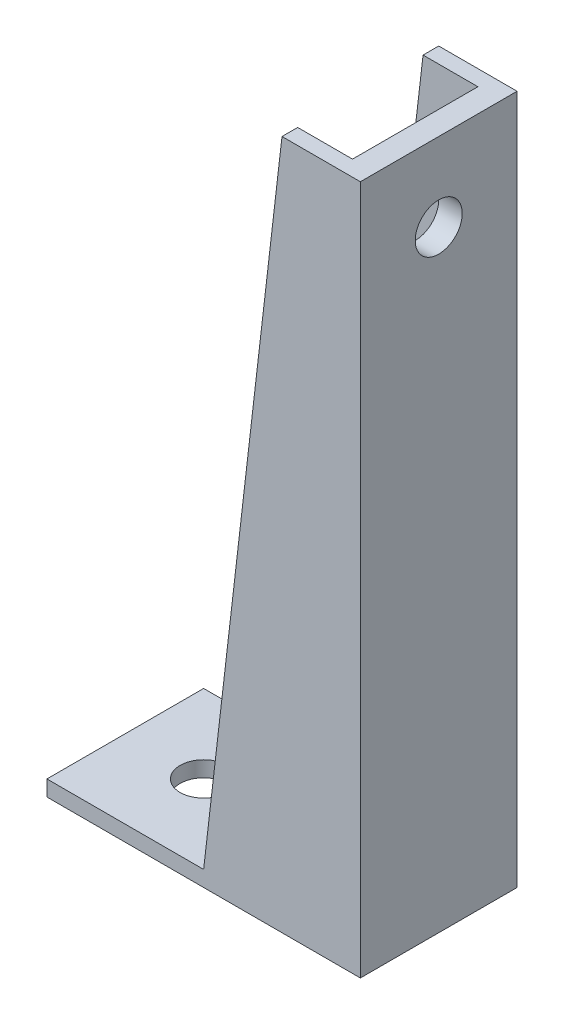
ISO-10303-21;
HEADER;
FILE_DESCRIPTION(('STEP AP214'),'2;1');
FILE_NAME('part.step','',(''),(''),'','','');
FILE_SCHEMA(('AUTOMOTIVE_DESIGN { 1 0 10303 214 1 1 1 1 }'));
ENDSEC;
DATA;
#1=APPLICATION_CONTEXT('core data for automotive mechanical design processes');
#2=APPLICATION_PROTOCOL_DEFINITION('international standard','automotive_design',2000,#1);
#3=PRODUCT_CONTEXT('',#1,'mechanical');
#4=PRODUCT('Part','Part','',(#3));
#5=PRODUCT_RELATED_PRODUCT_CATEGORY('part','',(#4));
#6=PRODUCT_DEFINITION_FORMATION('','',#4);
#7=PRODUCT_DEFINITION_CONTEXT('part definition',#1,'design');
#8=PRODUCT_DEFINITION('design','',#6,#7);
#9=PRODUCT_DEFINITION_SHAPE('','',#8);
#10=(LENGTH_UNIT() NAMED_UNIT(*) SI_UNIT(.MILLI.,.METRE.));
#11=(NAMED_UNIT(*) PLANE_ANGLE_UNIT() SI_UNIT($,.RADIAN.));
#12=(NAMED_UNIT(*) SI_UNIT($,.STERADIAN.) SOLID_ANGLE_UNIT());
#13=UNCERTAINTY_MEASURE_WITH_UNIT(LENGTH_MEASURE(1.E-05),#10,'distance_accuracy_value','');
#14=(GEOMETRIC_REPRESENTATION_CONTEXT(3) GLOBAL_UNCERTAINTY_ASSIGNED_CONTEXT((#13)) GLOBAL_UNIT_ASSIGNED_CONTEXT((#10,
#11,#12)) REPRESENTATION_CONTEXT('',''));
#15=CARTESIAN_POINT('',(0.,0.,0.));
#16=DIRECTION('',(0.,0.,1.));
#17=DIRECTION('',(1.,0.,0.));
#18=AXIS2_PLACEMENT_3D('',#15,#16,#17);
#19=CARTESIAN_POINT('',(0.,2.,0.));
#20=DIRECTION('',(0.,-1.,0.));
#21=DIRECTION('',(0.,0.,-1.));
#22=AXIS2_PLACEMENT_3D('',#19,#20,#21);
#23=PLANE('',#22);
#24=CARTESIAN_POINT('',(10.,2.,-10.));
#25=DIRECTION('',(0.,1.,0.));
#26=DIRECTION('',(0.,0.,1.));
#27=AXIS2_PLACEMENT_3D('',#24,#25,#26);
#28=CIRCLE('',#27,3.);
#29=CARTESIAN_POINT('',(10.,2.,-7.));
#30=VERTEX_POINT('',#29);
#31=EDGE_CURVE('E210',#30,#30,#28,.T.);
#32=ORIENTED_EDGE('',*,*,#31,.F.);
#33=EDGE_LOOP('',(#32));
#34=FACE_BOUND('',#33,.T.);
#35=DIRECTION('',(0.,0.,1.));
#36=VECTOR('',#35,1.);
#37=CARTESIAN_POINT('',(20.,2.,0.));
#38=LINE('',#37,#36);
#39=CARTESIAN_POINT('',(20.,2.,-20.));
#40=VERTEX_POINT('',#39);
#41=CARTESIAN_POINT('',(20.,2.,0.));
#42=VERTEX_POINT('',#41);
#43=EDGE_CURVE('E115',#40,#42,#38,.T.);
#44=ORIENTED_EDGE('',*,*,#43,.F.);
#45=DIRECTION('',(-1.,0.,0.));
#46=VECTOR('',#45,1.);
#47=CARTESIAN_POINT('',(0.,2.,-20.));
#48=LINE('',#47,#46);
#49=CARTESIAN_POINT('',(0.,2.,-20.));
#50=VERTEX_POINT('',#49);
#51=EDGE_CURVE('E141',#40,#50,#48,.T.);
#52=ORIENTED_EDGE('',*,*,#51,.T.);
#53=DIRECTION('',(0.,0.,1.));
#54=VECTOR('',#53,1.);
#55=CARTESIAN_POINT('',(0.,2.,0.));
#56=LINE('',#55,#54);
#57=CARTESIAN_POINT('',(0.,2.,0.));
#58=VERTEX_POINT('',#57);
#59=EDGE_CURVE('E139',#50,#58,#56,.T.);
#60=ORIENTED_EDGE('',*,*,#59,.T.);
#61=DIRECTION('',(1.,0.,0.));
#62=VECTOR('',#61,1.);
#63=CARTESIAN_POINT('',(0.,2.,0.));
#64=LINE('',#63,#62);
#65=EDGE_CURVE('E132',#58,#42,#64,.T.);
#66=ORIENTED_EDGE('',*,*,#65,.T.);
#67=EDGE_LOOP('',(#44,#52,#60,#66));
#68=FACE_BOUND('',#67,.T.);
#69=ADVANCED_FACE('F34',(#34,#68),#23,.F.);
#70=CARTESIAN_POINT('',(0.,2.,0.));
#71=DIRECTION('',(1.,0.,0.));
#72=DIRECTION('',(0.,0.,-1.));
#73=AXIS2_PLACEMENT_3D('',#70,#71,#72);
#74=PLANE('',#73);
#75=DIRECTION('',(0.,0.,1.));
#76=VECTOR('',#75,1.);
#77=CARTESIAN_POINT('',(0.,0.,0.));
#78=LINE('',#77,#76);
#79=CARTESIAN_POINT('',(0.,0.,-20.));
#80=VERTEX_POINT('',#79);
#81=CARTESIAN_POINT('',(0.,0.,0.));
#82=VERTEX_POINT('',#81);
#83=EDGE_CURVE('E149',#80,#82,#78,.T.);
#84=ORIENTED_EDGE('',*,*,#83,.T.);
#85=DIRECTION('',(0.,-1.,0.));
#86=VECTOR('',#85,1.);
#87=CARTESIAN_POINT('',(0.,2.,0.));
#88=LINE('',#87,#86);
#89=EDGE_CURVE('E42',#58,#82,#88,.T.);
#90=ORIENTED_EDGE('',*,*,#89,.F.);
#91=ORIENTED_EDGE('',*,*,#59,.F.);
#92=DIRECTION('',(0.,-1.,0.));
#93=VECTOR('',#92,1.);
#94=CARTESIAN_POINT('',(0.,2.,-20.));
#95=LINE('',#94,#93);
#96=EDGE_CURVE('E143',#50,#80,#95,.T.);
#97=ORIENTED_EDGE('',*,*,#96,.T.);
#98=EDGE_LOOP('',(#84,#90,#91,#97));
#99=FACE_BOUND('',#98,.T.);
#100=ADVANCED_FACE('F36',(#99),#74,.F.);
#101=CARTESIAN_POINT('',(0.,2.,0.));
#102=DIRECTION('',(0.,0.,-1.));
#103=DIRECTION('',(-1.,0.,0.));
#104=AXIS2_PLACEMENT_3D('',#101,#102,#103);
#105=PLANE('',#104);
#106=DIRECTION('',(1.,0.,0.));
#107=VECTOR('',#106,1.);
#108=CARTESIAN_POINT('',(40.,88.,0.));
#109=LINE('',#108,#107);
#110=CARTESIAN_POINT('',(30.,88.,0.));
#111=VERTEX_POINT('',#110);
#112=CARTESIAN_POINT('',(40.,88.,0.));
#113=VERTEX_POINT('',#112);
#114=EDGE_CURVE('E135',#111,#113,#109,.T.);
#115=ORIENTED_EDGE('',*,*,#114,.F.);
#116=DIRECTION('',(0.115500858174565,0.993307380301253,0.));
#117=VECTOR('',#116,1.);
#118=CARTESIAN_POINT('',(30.,88.,0.));
#119=LINE('',#118,#117);
#120=EDGE_CURVE('E118',#42,#111,#119,.T.);
#121=ORIENTED_EDGE('',*,*,#120,.F.);
#122=ORIENTED_EDGE('',*,*,#65,.F.);
#123=ORIENTED_EDGE('',*,*,#89,.T.);
#124=DIRECTION('',(1.,0.,0.));
#125=VECTOR('',#124,1.);
#126=CARTESIAN_POINT('',(0.,0.,0.));
#127=LINE('',#126,#125);
#128=CARTESIAN_POINT('',(40.,0.,0.));
#129=VERTEX_POINT('',#128);
#130=EDGE_CURVE('E152',#82,#129,#127,.T.);
#131=ORIENTED_EDGE('',*,*,#130,.T.);
#132=DIRECTION('',(0.,-1.,0.));
#133=VECTOR('',#132,1.);
#134=CARTESIAN_POINT('',(40.,2.,0.));
#135=LINE('',#134,#133);
#136=EDGE_CURVE('E163',#113,#129,#135,.T.);
#137=ORIENTED_EDGE('',*,*,#136,.F.);
#138=EDGE_LOOP('',(#115,#121,#122,#123,#131,#137));
#139=FACE_BOUND('',#138,.T.);
#140=ADVANCED_FACE('F130',(#139),#105,.F.);
#141=CARTESIAN_POINT('',(40.,2.,0.));
#142=DIRECTION('',(-1.,0.,0.));
#143=DIRECTION('',(0.,0.,1.));
#144=AXIS2_PLACEMENT_3D('',#141,#142,#143);
#145=PLANE('',#144);
#146=CARTESIAN_POINT('',(40.,78.,-10.));
#147=DIRECTION('',(1.,0.,0.));
#148=DIRECTION('',(0.,0.,-1.));
#149=AXIS2_PLACEMENT_3D('',#146,#147,#148);
#150=CIRCLE('',#149,3.);
#151=CARTESIAN_POINT('',(40.,78.,-13.));
#152=VERTEX_POINT('',#151);
#153=EDGE_CURVE('E169',#152,#152,#150,.T.);
#154=ORIENTED_EDGE('',*,*,#153,.F.);
#155=EDGE_LOOP('',(#154));
#156=FACE_BOUND('',#155,.T.);
#157=DIRECTION('',(0.,0.,-1.));
#158=VECTOR('',#157,1.);
#159=CARTESIAN_POINT('',(40.,0.,0.));
#160=LINE('',#159,#158);
#161=CARTESIAN_POINT('',(40.,0.,-20.));
#162=VERTEX_POINT('',#161);
#163=EDGE_CURVE('E155',#129,#162,#160,.T.);
#164=ORIENTED_EDGE('',*,*,#163,.T.);
#165=DIRECTION('',(0.,-1.,0.));
#166=VECTOR('',#165,1.);
#167=CARTESIAN_POINT('',(40.,2.,-20.));
#168=LINE('',#167,#166);
#169=CARTESIAN_POINT('',(40.,88.,-20.));
#170=VERTEX_POINT('',#169);
#171=EDGE_CURVE('E160',#170,#162,#168,.T.);
#172=ORIENTED_EDGE('',*,*,#171,.F.);
#173=DIRECTION('',(0.,0.,-1.));
#174=VECTOR('',#173,1.);
#175=CARTESIAN_POINT('',(40.,88.,0.));
#176=LINE('',#175,#174);
#177=EDGE_CURVE('E125',#113,#170,#176,.T.);
#178=ORIENTED_EDGE('',*,*,#177,.F.);
#179=ORIENTED_EDGE('',*,*,#136,.T.);
#180=EDGE_LOOP('',(#164,#172,#178,#179));
#181=FACE_BOUND('',#180,.T.);
#182=ADVANCED_FACE('F261',(#156,#181),#145,.F.);
#183=CARTESIAN_POINT('',(0.,2.,-20.));
#184=DIRECTION('',(0.,0.,1.));
#185=DIRECTION('',(1.,0.,0.));
#186=AXIS2_PLACEMENT_3D('',#183,#184,#185);
#187=PLANE('',#186);
#188=ORIENTED_EDGE('',*,*,#51,.F.);
#189=DIRECTION('',(0.115500858174565,0.993307380301254,0.));
#190=VECTOR('',#189,1.);
#191=CARTESIAN_POINT('',(19.7331910352188,-0.294557097118468,-20.));
#192=LINE('',#191,#190);
#193=CARTESIAN_POINT('',(30.,88.,-20.));
#194=VERTEX_POINT('',#193);
#195=EDGE_CURVE('E121',#40,#194,#192,.T.);
#196=ORIENTED_EDGE('',*,*,#195,.T.);
#197=DIRECTION('',(-1.,0.,0.));
#198=VECTOR('',#197,1.);
#199=CARTESIAN_POINT('',(40.,88.,-20.));
#200=LINE('',#199,#198);
#201=EDGE_CURVE('E207',#170,#194,#200,.T.);
#202=ORIENTED_EDGE('',*,*,#201,.F.);
#203=ORIENTED_EDGE('',*,*,#171,.T.);
#204=DIRECTION('',(-1.,0.,0.));
#205=VECTOR('',#204,1.);
#206=CARTESIAN_POINT('',(0.,0.,-20.));
#207=LINE('',#206,#205);
#208=EDGE_CURVE('E145',#162,#80,#207,.T.);
#209=ORIENTED_EDGE('',*,*,#208,.T.);
#210=ORIENTED_EDGE('',*,*,#96,.F.);
#211=EDGE_LOOP('',(#188,#196,#202,#203,#209,#210));
#212=FACE_BOUND('',#211,.T.);
#213=ADVANCED_FACE('F264',(#212),#187,.F.);
#214=CARTESIAN_POINT('',(0.,0.,0.));
#215=DIRECTION('',(0.,-1.,0.));
#216=DIRECTION('',(0.,0.,-1.));
#217=AXIS2_PLACEMENT_3D('',#214,#215,#216);
#218=PLANE('',#217);
#219=CARTESIAN_POINT('',(10.,0.,-10.));
#220=DIRECTION('',(0.,1.,0.));
#221=DIRECTION('',(0.,0.,1.));
#222=AXIS2_PLACEMENT_3D('',#219,#220,#221);
#223=CIRCLE('',#222,3.);
#224=CARTESIAN_POINT('',(10.,0.,-7.));
#225=VERTEX_POINT('',#224);
#226=EDGE_CURVE('E153',#225,#225,#223,.T.);
#227=ORIENTED_EDGE('',*,*,#226,.T.);
#228=EDGE_LOOP('',(#227));
#229=FACE_BOUND('',#228,.T.);
#230=ORIENTED_EDGE('',*,*,#83,.F.);
#231=ORIENTED_EDGE('',*,*,#208,.F.);
#232=ORIENTED_EDGE('',*,*,#163,.F.);
#233=ORIENTED_EDGE('',*,*,#130,.F.);
#234=EDGE_LOOP('',(#230,#231,#232,#233));
#235=FACE_BOUND('',#234,.T.);
#236=ADVANCED_FACE('F268',(#229,#235),#218,.T.);
#237=CARTESIAN_POINT('',(10.,0.,-10.));
#238=DIRECTION('',(0.,1.,0.));
#239=DIRECTION('',(0.,0.,1.));
#240=AXIS2_PLACEMENT_3D('',#237,#238,#239);
#241=CYLINDRICAL_SURFACE('',#240,3.);
#242=ORIENTED_EDGE('',*,*,#226,.F.);
#243=EDGE_LOOP('',(#242));
#244=FACE_BOUND('',#243,.T.);
#245=ORIENTED_EDGE('',*,*,#31,.T.);
#246=EDGE_LOOP('',(#245));
#247=FACE_BOUND('',#246,.T.);
#248=ADVANCED_FACE('F216',(#244,#247),#241,.F.);
#249=CARTESIAN_POINT('',(0.,88.,0.));
#250=DIRECTION('',(0.,1.,0.));
#251=DIRECTION('',(0.,0.,1.));
#252=AXIS2_PLACEMENT_3D('',#249,#250,#251);
#253=PLANE('',#252);
#254=DIRECTION('',(0.,0.,1.));
#255=VECTOR('',#254,1.);
#256=CARTESIAN_POINT('',(30.,88.,-86.));
#257=LINE('',#256,#255);
#258=CARTESIAN_POINT('',(30.,88.,-2.));
#259=VERTEX_POINT('',#258);
#260=EDGE_CURVE('E136',#259,#111,#257,.T.);
#261=ORIENTED_EDGE('',*,*,#260,.T.);
#262=ORIENTED_EDGE('',*,*,#114,.T.);
#263=ORIENTED_EDGE('',*,*,#177,.T.);
#264=ORIENTED_EDGE('',*,*,#201,.T.);
#265=CARTESIAN_POINT('',(30.,88.,-18.));
#266=VERTEX_POINT('',#265);
#267=EDGE_CURVE('E247',#194,#266,#257,.T.);
#268=ORIENTED_EDGE('',*,*,#267,.T.);
#269=DIRECTION('',(-1.,0.,0.));
#270=VECTOR('',#269,1.);
#271=CARTESIAN_POINT('',(22.,88.,-18.));
#272=LINE('',#271,#270);
#273=CARTESIAN_POINT('',(37.,88.,-18.));
#274=VERTEX_POINT('',#273);
#275=EDGE_CURVE('E189',#274,#266,#272,.T.);
#276=ORIENTED_EDGE('',*,*,#275,.F.);
#277=DIRECTION('',(0.,0.,-1.));
#278=VECTOR('',#277,1.);
#279=CARTESIAN_POINT('',(37.,88.,-2.));
#280=LINE('',#279,#278);
#281=CARTESIAN_POINT('',(37.,88.,-2.));
#282=VERTEX_POINT('',#281);
#283=EDGE_CURVE('E185',#282,#274,#280,.T.);
#284=ORIENTED_EDGE('',*,*,#283,.F.);
#285=DIRECTION('',(1.,0.,0.));
#286=VECTOR('',#285,1.);
#287=CARTESIAN_POINT('',(22.,88.,-2.));
#288=LINE('',#287,#286);
#289=EDGE_CURVE('E183',#259,#282,#288,.T.);
#290=ORIENTED_EDGE('',*,*,#289,.F.);
#291=EDGE_LOOP('',(#261,#262,#263,#264,#268,#276,#284,#290));
#292=FACE_BOUND('',#291,.T.);
#293=ADVANCED_FACE('F246',(#292),#253,.T.);
#294=CARTESIAN_POINT('',(22.,88.,-2.));
#295=DIRECTION('',(1.,0.,0.));
#296=DIRECTION('',(0.,0.,-1.));
#297=AXIS2_PLACEMENT_3D('',#294,#295,#296);
#298=PLANE('',#297);
#299=DIRECTION('',(0.,0.,-1.));
#300=VECTOR('',#299,1.);
#301=CARTESIAN_POINT('',(22.,19.2000000000001,-2.));
#302=LINE('',#301,#300);
#303=CARTESIAN_POINT('',(22.,19.2000000000001,-2.));
#304=VERTEX_POINT('',#303);
#305=CARTESIAN_POINT('',(22.,19.2000000000002,-18.));
#306=VERTEX_POINT('',#305);
#307=EDGE_CURVE('E48',#304,#306,#302,.T.);
#308=ORIENTED_EDGE('',*,*,#307,.F.);
#309=DIRECTION('',(0.,-1.,0.));
#310=VECTOR('',#309,1.);
#311=CARTESIAN_POINT('',(22.,88.,-2.));
#312=LINE('',#311,#310);
#313=CARTESIAN_POINT('',(22.,2.,-2.));
#314=VERTEX_POINT('',#313);
#315=EDGE_CURVE('E126',#304,#314,#312,.T.);
#316=ORIENTED_EDGE('',*,*,#315,.T.);
#317=DIRECTION('',(0.,0.,1.));
#318=VECTOR('',#317,1.);
#319=CARTESIAN_POINT('',(22.,2.,-2.));
#320=LINE('',#319,#318);
#321=CARTESIAN_POINT('',(22.,2.,-18.));
#322=VERTEX_POINT('',#321);
#323=EDGE_CURVE('E168',#322,#314,#320,.T.);
#324=ORIENTED_EDGE('',*,*,#323,.F.);
#325=DIRECTION('',(0.,-1.,0.));
#326=VECTOR('',#325,1.);
#327=CARTESIAN_POINT('',(22.,88.,-18.));
#328=LINE('',#327,#326);
#329=EDGE_CURVE('E55',#306,#322,#328,.T.);
#330=ORIENTED_EDGE('',*,*,#329,.F.);
#331=EDGE_LOOP('',(#308,#316,#324,#330));
#332=FACE_BOUND('',#331,.T.);
#333=ADVANCED_FACE('F255',(#332),#298,.T.);
#334=CARTESIAN_POINT('',(22.,88.,-2.));
#335=DIRECTION('',(0.,0.,-1.));
#336=DIRECTION('',(-1.,0.,0.));
#337=AXIS2_PLACEMENT_3D('',#334,#335,#336);
#338=PLANE('',#337);
#339=DIRECTION('',(-0.115500858174565,-0.993307380301254,0.));
#340=VECTOR('',#339,1.);
#341=CARTESIAN_POINT('',(29.8932764140875,87.0821771611526,-2.));
#342=LINE('',#341,#340);
#343=EDGE_CURVE('E179',#259,#304,#342,.T.);
#344=ORIENTED_EDGE('',*,*,#343,.F.);
#345=ORIENTED_EDGE('',*,*,#289,.T.);
#346=DIRECTION('',(0.,-1.,0.));
#347=VECTOR('',#346,1.);
#348=CARTESIAN_POINT('',(37.,88.,-2.));
#349=LINE('',#348,#347);
#350=CARTESIAN_POINT('',(37.,2.,-2.));
#351=VERTEX_POINT('',#350);
#352=EDGE_CURVE('E202',#282,#351,#349,.T.);
#353=ORIENTED_EDGE('',*,*,#352,.T.);
#354=DIRECTION('',(1.,0.,0.));
#355=VECTOR('',#354,1.);
#356=CARTESIAN_POINT('',(22.,2.,-2.));
#357=LINE('',#356,#355);
#358=EDGE_CURVE('E173',#314,#351,#357,.T.);
#359=ORIENTED_EDGE('',*,*,#358,.F.);
#360=ORIENTED_EDGE('',*,*,#315,.F.);
#361=EDGE_LOOP('',(#344,#345,#353,#359,#360));
#362=FACE_BOUND('',#361,.T.);
#363=ADVANCED_FACE('F257',(#362),#338,.T.);
#364=CARTESIAN_POINT('',(37.,88.,-2.));
#365=DIRECTION('',(-1.,0.,0.));
#366=DIRECTION('',(0.,0.,1.));
#367=AXIS2_PLACEMENT_3D('',#364,#365,#366);
#368=PLANE('',#367);
#369=CARTESIAN_POINT('',(37.,78.,-10.));
#370=DIRECTION('',(-1.,0.,0.));
#371=DIRECTION('',(0.,0.,1.));
#372=AXIS2_PLACEMENT_3D('',#369,#370,#371);
#373=CIRCLE('',#372,3.);
#374=CARTESIAN_POINT('',(37.,78.,-7.00000000000001));
#375=VERTEX_POINT('',#374);
#376=EDGE_CURVE('E166',#375,#375,#373,.T.);
#377=ORIENTED_EDGE('',*,*,#376,.F.);
#378=EDGE_LOOP('',(#377));
#379=FACE_BOUND('',#378,.T.);
#380=DIRECTION('',(0.,0.,-1.));
#381=VECTOR('',#380,1.);
#382=CARTESIAN_POINT('',(37.,2.,-2.));
#383=LINE('',#382,#381);
#384=CARTESIAN_POINT('',(37.,2.,-18.));
#385=VERTEX_POINT('',#384);
#386=EDGE_CURVE('E194',#351,#385,#383,.T.);
#387=ORIENTED_EDGE('',*,*,#386,.F.);
#388=ORIENTED_EDGE('',*,*,#352,.F.);
#389=ORIENTED_EDGE('',*,*,#283,.T.);
#390=DIRECTION('',(0.,-1.,0.));
#391=VECTOR('',#390,1.);
#392=CARTESIAN_POINT('',(37.,88.,-18.));
#393=LINE('',#392,#391);
#394=EDGE_CURVE('E200',#274,#385,#393,.T.);
#395=ORIENTED_EDGE('',*,*,#394,.T.);
#396=EDGE_LOOP('',(#387,#388,#389,#395));
#397=FACE_BOUND('',#396,.T.);
#398=ADVANCED_FACE('F236',(#379,#397),#368,.T.);
#399=CARTESIAN_POINT('',(22.,88.,-18.));
#400=DIRECTION('',(0.,0.,1.));
#401=DIRECTION('',(1.,0.,0.));
#402=AXIS2_PLACEMENT_3D('',#399,#400,#401);
#403=PLANE('',#402);
#404=DIRECTION('',(0.115500858174565,0.993307380301254,0.));
#405=VECTOR('',#404,1.);
#406=CARTESIAN_POINT('',(29.8932764140875,87.0821771611526,-18.));
#407=LINE('',#406,#405);
#408=EDGE_CURVE('E11',#306,#266,#407,.T.);
#409=ORIENTED_EDGE('',*,*,#408,.F.);
#410=ORIENTED_EDGE('',*,*,#329,.T.);
#411=DIRECTION('',(-1.,0.,0.));
#412=VECTOR('',#411,1.);
#413=CARTESIAN_POINT('',(22.,2.,-18.));
#414=LINE('',#413,#412);
#415=EDGE_CURVE('E186',#385,#322,#414,.T.);
#416=ORIENTED_EDGE('',*,*,#415,.F.);
#417=ORIENTED_EDGE('',*,*,#394,.F.);
#418=ORIENTED_EDGE('',*,*,#275,.T.);
#419=EDGE_LOOP('',(#409,#410,#416,#417,#418));
#420=FACE_BOUND('',#419,.T.);
#421=ADVANCED_FACE('F229',(#420),#403,.T.);
#422=ORIENTED_EDGE('',*,*,#415,.T.);
#423=ORIENTED_EDGE('',*,*,#323,.T.);
#424=ORIENTED_EDGE('',*,*,#358,.T.);
#425=ORIENTED_EDGE('',*,*,#386,.T.);
#426=EDGE_LOOP('',(#422,#423,#424,#425));
#427=FACE_BOUND('',#426,.T.);
#428=ADVANCED_FACE('F220',(#427),#23,.F.);
#429=CARTESIAN_POINT('',(-46.,78.,-9.99999999999987));
#430=DIRECTION('',(1.,0.,0.));
#431=DIRECTION('',(0.,0.,-1.));
#432=AXIS2_PLACEMENT_3D('',#429,#430,#431);
#433=CYLINDRICAL_SURFACE('',#432,3.);
#434=ORIENTED_EDGE('',*,*,#376,.T.);
#435=EDGE_LOOP('',(#434));
#436=FACE_BOUND('',#435,.T.);
#437=ORIENTED_EDGE('',*,*,#153,.T.);
#438=EDGE_LOOP('',(#437));
#439=FACE_BOUND('',#438,.T.);
#440=ADVANCED_FACE('F228',(#436,#439),#433,.F.);
#441=CARTESIAN_POINT('',(30.,88.,-86.));
#442=DIRECTION('',(0.993307380301254,-0.115500858174565,0.));
#443=DIRECTION('',(0.115500858174565,0.993307380301254,0.));
#444=AXIS2_PLACEMENT_3D('',#441,#442,#443);
#445=PLANE('',#444);
#446=ORIENTED_EDGE('',*,*,#43,.T.);
#447=ORIENTED_EDGE('',*,*,#120,.T.);
#448=ORIENTED_EDGE('',*,*,#260,.F.);
#449=ORIENTED_EDGE('',*,*,#343,.T.);
#450=ORIENTED_EDGE('',*,*,#307,.T.);
#451=ORIENTED_EDGE('',*,*,#408,.T.);
#452=ORIENTED_EDGE('',*,*,#267,.F.);
#453=ORIENTED_EDGE('',*,*,#195,.F.);
#454=EDGE_LOOP('',(#446,#447,#448,#449,#450,#451,#452,#453));
#455=FACE_BOUND('',#454,.T.);
#456=ADVANCED_FACE('F117',(#455),#445,.F.);
#457=CLOSED_SHELL('',(#69,#100,#140,#182,#213,#236,#248,#293,#333,#363,#398,#421,#428,#440,#456));
#458=MANIFOLD_SOLID_BREP('B2',#457);
#459=ADVANCED_BREP_SHAPE_REPRESENTATION('',(#18,#458),#14);
#460=SHAPE_DEFINITION_REPRESENTATION(#9,#459);
ENDSEC;
END-ISO-10303-21;
